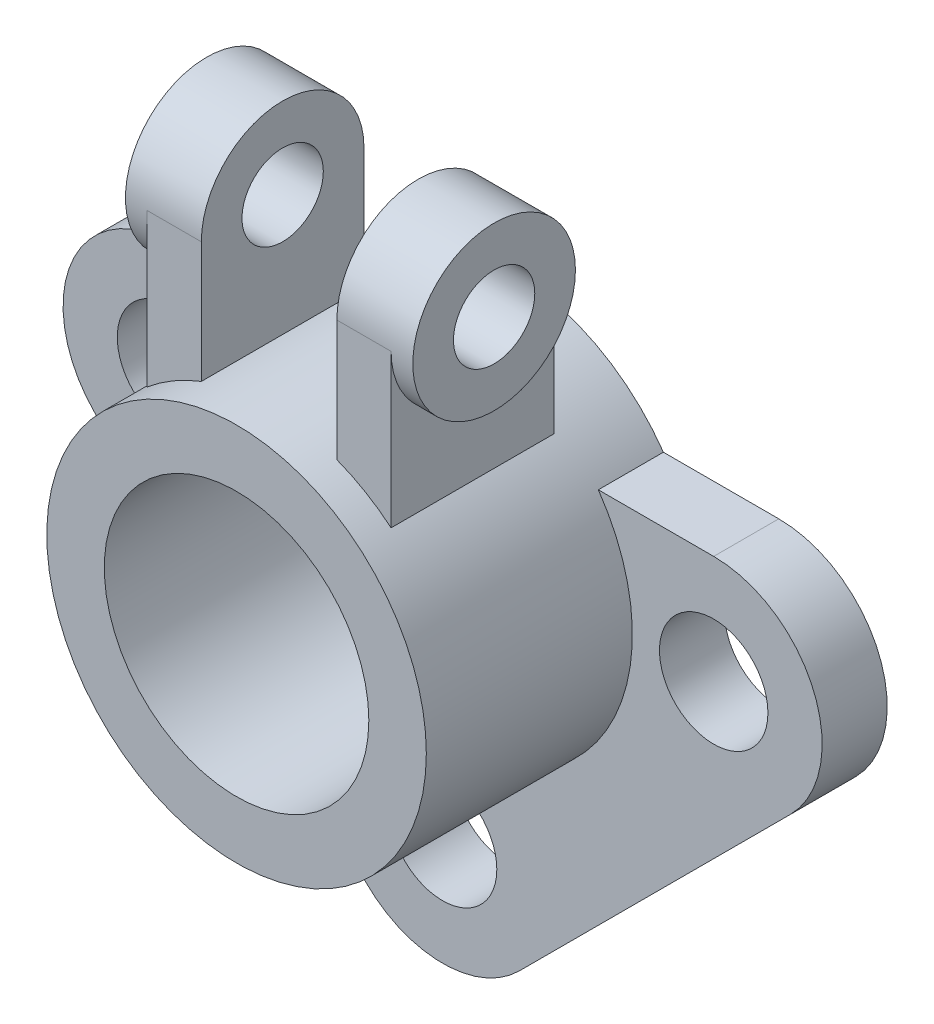
ISO-10303-21;
HEADER;
FILE_DESCRIPTION(('STEP AP214'),'2;1');
FILE_NAME('part.step','',(''),(''),'','','');
FILE_SCHEMA(('AUTOMOTIVE_DESIGN { 1 0 10303 214 1 1 1 1 }'));
ENDSEC;
DATA;
#1=APPLICATION_CONTEXT('core data for automotive mechanical design processes');
#2=APPLICATION_PROTOCOL_DEFINITION('international standard','automotive_design',2000,#1);
#3=PRODUCT_CONTEXT('',#1,'mechanical');
#4=PRODUCT('Part','Part','',(#3));
#5=PRODUCT_RELATED_PRODUCT_CATEGORY('part','',(#4));
#6=PRODUCT_DEFINITION_FORMATION('','',#4);
#7=PRODUCT_DEFINITION_CONTEXT('part definition',#1,'design');
#8=PRODUCT_DEFINITION('design','',#6,#7);
#9=PRODUCT_DEFINITION_SHAPE('','',#8);
#10=(LENGTH_UNIT() NAMED_UNIT(*) SI_UNIT(.MILLI.,.METRE.));
#11=(NAMED_UNIT(*) PLANE_ANGLE_UNIT() SI_UNIT($,.RADIAN.));
#12=(NAMED_UNIT(*) SI_UNIT($,.STERADIAN.) SOLID_ANGLE_UNIT());
#13=UNCERTAINTY_MEASURE_WITH_UNIT(LENGTH_MEASURE(1.E-05),#10,'distance_accuracy_value','');
#14=(GEOMETRIC_REPRESENTATION_CONTEXT(3) GLOBAL_UNCERTAINTY_ASSIGNED_CONTEXT((#13)) GLOBAL_UNIT_ASSIGNED_CONTEXT((#10,
#11,#12)) REPRESENTATION_CONTEXT('',''));
#15=CARTESIAN_POINT('',(0.,0.,0.));
#16=DIRECTION('',(0.,0.,1.));
#17=DIRECTION('',(1.,0.,0.));
#18=AXIS2_PLACEMENT_3D('',#15,#16,#17);
#19=CARTESIAN_POINT('',(0.,0.,50.));
#20=DIRECTION('',(0.,0.,-1.));
#21=DIRECTION('',(-1.,0.,0.));
#22=AXIS2_PLACEMENT_3D('',#19,#20,#21);
#23=CYLINDRICAL_SURFACE('',#22,35.);
#24=CARTESIAN_POINT('',(0.,0.,50.));
#25=DIRECTION('',(0.,0.,1.));
#26=DIRECTION('',(1.,0.,0.));
#27=AXIS2_PLACEMENT_3D('',#24,#25,#26);
#28=CIRCLE('',#27,35.);
#29=CARTESIAN_POINT('',(35.,0.,50.));
#30=VERTEX_POINT('',#29);
#31=EDGE_CURVE('E260',#30,#30,#28,.T.);
#32=ORIENTED_EDGE('',*,*,#31,.F.);
#33=EDGE_LOOP('',(#32));
#34=FACE_BOUND('',#33,.T.);
#35=DIRECTION('',(0.,0.,-1.));
#36=VECTOR('',#35,1.);
#37=CARTESIAN_POINT('',(-28.7228132326902,20.,12.));
#38=LINE('',#37,#36);
#39=CARTESIAN_POINT('',(-28.7228132326902,20.,12.));
#40=VERTEX_POINT('',#39);
#41=CARTESIAN_POINT('',(-28.7228132326902,20.,0.));
#42=VERTEX_POINT('',#41);
#43=EDGE_CURVE('E368',#40,#42,#38,.T.);
#44=ORIENTED_EDGE('',*,*,#43,.F.);
#45=CARTESIAN_POINT('',(0.,0.,12.));
#46=DIRECTION('',(0.,0.,1.));
#47=DIRECTION('',(1.,0.,0.));
#48=AXIS2_PLACEMENT_3D('',#45,#46,#47);
#49=CIRCLE('',#48,35.);
#50=CARTESIAN_POINT('',(28.7228132326901,20.,12.));
#51=VERTEX_POINT('',#50);
#52=EDGE_CURVE('E271',#40,#51,#49,.T.);
#53=ORIENTED_EDGE('',*,*,#52,.T.);
#54=DIRECTION('',(0.,0.,-1.));
#55=VECTOR('',#54,1.);
#56=CARTESIAN_POINT('',(28.7228132326901,20.,12.));
#57=LINE('',#56,#55);
#58=CARTESIAN_POINT('',(28.7228132326901,20.,0.));
#59=VERTEX_POINT('',#58);
#60=EDGE_CURVE('E311',#51,#59,#57,.T.);
#61=ORIENTED_EDGE('',*,*,#60,.T.);
#62=CARTESIAN_POINT('',(0.,0.,0.));
#63=DIRECTION('',(0.,0.,1.));
#64=DIRECTION('',(1.,0.,0.));
#65=AXIS2_PLACEMENT_3D('',#62,#63,#64);
#66=CIRCLE('',#65,35.);
#67=EDGE_CURVE('E261',#59,#42,#66,.T.);
#68=ORIENTED_EDGE('',*,*,#67,.T.);
#69=EDGE_LOOP('',(#44,#53,#61,#68));
#70=FACE_BOUND('',#69,.T.);
#71=CARTESIAN_POINT('',(0.,0.,14.));
#72=DIRECTION('',(0.,0.,1.));
#73=DIRECTION('',(1.,0.,0.));
#74=AXIS2_PLACEMENT_3D('',#71,#72,#73);
#75=CIRCLE('',#74,35.);
#76=CARTESIAN_POINT('',(22.5,26.809513236909,14.));
#77=VERTEX_POINT('',#76);
#78=CARTESIAN_POINT('',(12.5,32.6917420765551,14.));
#79=VERTEX_POINT('',#78);
#80=EDGE_CURVE('E376',#77,#79,#75,.T.);
#81=ORIENTED_EDGE('',*,*,#80,.F.);
#82=DIRECTION('',(0.,0.,-1.));
#83=VECTOR('',#82,1.);
#84=CARTESIAN_POINT('',(22.5,26.809513236909,50.));
#85=LINE('',#84,#83);
#86=CARTESIAN_POINT('',(22.5,26.809513236909,44.));
#87=VERTEX_POINT('',#86);
#88=EDGE_CURVE('E12',#77,#87,#85,.F.);
#89=ORIENTED_EDGE('',*,*,#88,.T.);
#90=CARTESIAN_POINT('',(0.,0.,44.));
#91=DIRECTION('',(0.,0.,-1.));
#92=DIRECTION('',(-1.,0.,0.));
#93=AXIS2_PLACEMENT_3D('',#90,#91,#92);
#94=CIRCLE('',#93,35.);
#95=CARTESIAN_POINT('',(12.5,32.6917420765551,44.));
#96=VERTEX_POINT('',#95);
#97=EDGE_CURVE('E65',#96,#87,#94,.T.);
#98=ORIENTED_EDGE('',*,*,#97,.F.);
#99=DIRECTION('',(0.,0.,-1.));
#100=VECTOR('',#99,1.);
#101=CARTESIAN_POINT('',(12.5,32.6917420765551,50.));
#102=LINE('',#101,#100);
#103=EDGE_CURVE('E372',#79,#96,#102,.F.);
#104=ORIENTED_EDGE('',*,*,#103,.F.);
#105=EDGE_LOOP('',(#81,#89,#98,#104));
#106=FACE_BOUND('',#105,.T.);
#107=CARTESIAN_POINT('',(0.,0.,44.));
#108=DIRECTION('',(0.,0.,1.));
#109=DIRECTION('',(1.,0.,0.));
#110=AXIS2_PLACEMENT_3D('',#107,#108,#109);
#111=CIRCLE('',#110,35.);
#112=CARTESIAN_POINT('',(-12.5,32.6917420765551,44.));
#113=VERTEX_POINT('',#112);
#114=CARTESIAN_POINT('',(-22.5,26.809513236909,44.));
#115=VERTEX_POINT('',#114);
#116=EDGE_CURVE('E72',#113,#115,#111,.T.);
#117=ORIENTED_EDGE('',*,*,#116,.T.);
#118=DIRECTION('',(0.,0.,-1.));
#119=VECTOR('',#118,1.);
#120=CARTESIAN_POINT('',(-22.5,26.809513236909,50.));
#121=LINE('',#120,#119);
#122=CARTESIAN_POINT('',(-22.5,26.809513236909,14.));
#123=VERTEX_POINT('',#122);
#124=EDGE_CURVE('E210',#123,#115,#121,.F.);
#125=ORIENTED_EDGE('',*,*,#124,.F.);
#126=CARTESIAN_POINT('',(0.,0.,14.));
#127=DIRECTION('',(0.,0.,-1.));
#128=DIRECTION('',(-1.,0.,0.));
#129=AXIS2_PLACEMENT_3D('',#126,#127,#128);
#130=CIRCLE('',#129,35.);
#131=CARTESIAN_POINT('',(-12.5,32.6917420765551,14.));
#132=VERTEX_POINT('',#131);
#133=EDGE_CURVE('E205',#123,#132,#130,.T.);
#134=ORIENTED_EDGE('',*,*,#133,.T.);
#135=DIRECTION('',(0.,0.,-1.));
#136=VECTOR('',#135,1.);
#137=CARTESIAN_POINT('',(-12.5,32.6917420765551,50.));
#138=LINE('',#137,#136);
#139=EDGE_CURVE('E77',#132,#113,#138,.F.);
#140=ORIENTED_EDGE('',*,*,#139,.T.);
#141=EDGE_LOOP('',(#117,#125,#134,#140));
#142=FACE_BOUND('',#141,.T.);
#143=ADVANCED_FACE('F56',(#34,#70,#106,#142),#23,.T.);
#144=CARTESIAN_POINT('',(0.,20.,12.));
#145=DIRECTION('',(0.,1.,0.));
#146=DIRECTION('',(-1.,0.,0.));
#147=AXIS2_PLACEMENT_3D('',#144,#145,#146);
#148=PLANE('',#147);
#149=DIRECTION('',(1.,0.,0.));
#150=VECTOR('',#149,1.);
#151=CARTESIAN_POINT('',(0.,20.,0.));
#152=LINE('',#151,#150);
#153=CARTESIAN_POINT('',(-50.,20.,0.));
#154=VERTEX_POINT('',#153);
#155=EDGE_CURVE('E265',#154,#42,#152,.T.);
#156=ORIENTED_EDGE('',*,*,#155,.F.);
#157=DIRECTION('',(0.,0.,-1.));
#158=VECTOR('',#157,1.);
#159=CARTESIAN_POINT('',(-50.,20.,12.));
#160=LINE('',#159,#158);
#161=CARTESIAN_POINT('',(-50.,20.,12.));
#162=VERTEX_POINT('',#161);
#163=EDGE_CURVE('E365',#162,#154,#160,.T.);
#164=ORIENTED_EDGE('',*,*,#163,.F.);
#165=DIRECTION('',(1.,0.,0.));
#166=VECTOR('',#165,1.);
#167=CARTESIAN_POINT('',(0.,20.,12.));
#168=LINE('',#167,#166);
#169=EDGE_CURVE('E274',#162,#40,#168,.T.);
#170=ORIENTED_EDGE('',*,*,#169,.T.);
#171=ORIENTED_EDGE('',*,*,#43,.T.);
#172=EDGE_LOOP('',(#156,#164,#170,#171));
#173=FACE_BOUND('',#172,.T.);
#174=ADVANCED_FACE('F412',(#173),#148,.T.);
#175=CARTESIAN_POINT('',(-50.,0.,12.));
#176=DIRECTION('',(0.,0.,-1.));
#177=DIRECTION('',(-1.,0.,0.));
#178=AXIS2_PLACEMENT_3D('',#175,#176,#177);
#179=CYLINDRICAL_SURFACE('',#178,20.);
#180=CARTESIAN_POINT('',(-50.,0.,0.));
#181=DIRECTION('',(0.,0.,1.));
#182=DIRECTION('',(1.,0.,0.));
#183=AXIS2_PLACEMENT_3D('',#180,#181,#182);
#184=CIRCLE('',#183,20.);
#185=CARTESIAN_POINT('',(-64.142135623731,-14.142135623731,0.));
#186=VERTEX_POINT('',#185);
#187=EDGE_CURVE('E315',#154,#186,#184,.T.);
#188=ORIENTED_EDGE('',*,*,#187,.T.);
#189=DIRECTION('',(0.,0.,-1.));
#190=VECTOR('',#189,1.);
#191=CARTESIAN_POINT('',(-64.142135623731,-14.142135623731,12.));
#192=LINE('',#191,#190);
#193=CARTESIAN_POINT('',(-64.142135623731,-14.142135623731,12.));
#194=VERTEX_POINT('',#193);
#195=EDGE_CURVE('E362',#194,#186,#192,.T.);
#196=ORIENTED_EDGE('',*,*,#195,.F.);
#197=CARTESIAN_POINT('',(-50.,0.,12.));
#198=DIRECTION('',(0.,0.,1.));
#199=DIRECTION('',(1.,0.,0.));
#200=AXIS2_PLACEMENT_3D('',#197,#198,#199);
#201=CIRCLE('',#200,20.);
#202=EDGE_CURVE('E279',#162,#194,#201,.T.);
#203=ORIENTED_EDGE('',*,*,#202,.F.);
#204=ORIENTED_EDGE('',*,*,#163,.T.);
#205=EDGE_LOOP('',(#188,#196,#203,#204));
#206=FACE_BOUND('',#205,.T.);
#207=ADVANCED_FACE('F58',(#206),#179,.T.);
#208=CARTESIAN_POINT('',(-39.142135623731,-39.142135623731,12.));
#209=DIRECTION('',(-0.707106781186547,-0.707106781186547,0.));
#210=DIRECTION('',(0.707106781186548,-0.707106781186548,0.));
#211=AXIS2_PLACEMENT_3D('',#208,#209,#210);
#212=PLANE('',#211);
#213=DIRECTION('',(-0.707106781186548,0.707106781186548,0.));
#214=VECTOR('',#213,1.);
#215=CARTESIAN_POINT('',(-39.142135623731,-39.142135623731,0.));
#216=LINE('',#215,#214);
#217=CARTESIAN_POINT('',(-14.142135623731,-64.142135623731,0.));
#218=VERTEX_POINT('',#217);
#219=EDGE_CURVE('E320',#218,#186,#216,.T.);
#220=ORIENTED_EDGE('',*,*,#219,.F.);
#221=DIRECTION('',(0.,0.,-1.));
#222=VECTOR('',#221,1.);
#223=CARTESIAN_POINT('',(-14.142135623731,-64.142135623731,12.));
#224=LINE('',#223,#222);
#225=CARTESIAN_POINT('',(-14.142135623731,-64.142135623731,12.));
#226=VERTEX_POINT('',#225);
#227=EDGE_CURVE('E359',#226,#218,#224,.T.);
#228=ORIENTED_EDGE('',*,*,#227,.F.);
#229=DIRECTION('',(-0.707106781186548,0.707106781186548,0.));
#230=VECTOR('',#229,1.);
#231=CARTESIAN_POINT('',(-39.142135623731,-39.142135623731,12.));
#232=LINE('',#231,#230);
#233=EDGE_CURVE('E283',#226,#194,#232,.T.);
#234=ORIENTED_EDGE('',*,*,#233,.T.);
#235=ORIENTED_EDGE('',*,*,#195,.T.);
#236=EDGE_LOOP('',(#220,#228,#234,#235));
#237=FACE_BOUND('',#236,.T.);
#238=ADVANCED_FACE('F462',(#237),#212,.T.);
#239=CARTESIAN_POINT('',(0.,-50.,12.));
#240=DIRECTION('',(0.,0.,-1.));
#241=DIRECTION('',(-1.,0.,0.));
#242=AXIS2_PLACEMENT_3D('',#239,#240,#241);
#243=CYLINDRICAL_SURFACE('',#242,20.);
#244=CARTESIAN_POINT('',(0.,-50.,0.));
#245=DIRECTION('',(0.,0.,1.));
#246=DIRECTION('',(1.,0.,0.));
#247=AXIS2_PLACEMENT_3D('',#244,#245,#246);
#248=CIRCLE('',#247,20.);
#249=CARTESIAN_POINT('',(14.1421356237309,-64.142135623731,0.));
#250=VERTEX_POINT('',#249);
#251=EDGE_CURVE('E324',#250,#218,#248,.F.);
#252=ORIENTED_EDGE('',*,*,#251,.F.);
#253=DIRECTION('',(0.,0.,-1.));
#254=VECTOR('',#253,1.);
#255=CARTESIAN_POINT('',(14.1421356237309,-64.142135623731,12.));
#256=LINE('',#255,#254);
#257=CARTESIAN_POINT('',(14.1421356237309,-64.142135623731,12.));
#258=VERTEX_POINT('',#257);
#259=EDGE_CURVE('E356',#258,#250,#256,.T.);
#260=ORIENTED_EDGE('',*,*,#259,.F.);
#261=CARTESIAN_POINT('',(0.,-50.,12.));
#262=DIRECTION('',(0.,0.,1.));
#263=DIRECTION('',(1.,0.,0.));
#264=AXIS2_PLACEMENT_3D('',#261,#262,#263);
#265=CIRCLE('',#264,20.);
#266=EDGE_CURVE('E287',#258,#226,#265,.F.);
#267=ORIENTED_EDGE('',*,*,#266,.T.);
#268=ORIENTED_EDGE('',*,*,#227,.T.);
#269=EDGE_LOOP('',(#252,#260,#267,#268));
#270=FACE_BOUND('',#269,.T.);
#271=ADVANCED_FACE('F459',(#270),#243,.T.);
#272=CARTESIAN_POINT('',(39.1421356237309,-39.1421356237309,12.));
#273=DIRECTION('',(0.707106781186547,-0.707106781186547,0.));
#274=DIRECTION('',(0.707106781186548,0.707106781186548,0.));
#275=AXIS2_PLACEMENT_3D('',#272,#273,#274);
#276=PLANE('',#275);
#277=DIRECTION('',(-0.707106781186548,-0.707106781186548,0.));
#278=VECTOR('',#277,1.);
#279=CARTESIAN_POINT('',(39.1421356237309,-39.1421356237309,0.));
#280=LINE('',#279,#278);
#281=CARTESIAN_POINT('',(64.142135623731,-14.1421356237309,0.));
#282=VERTEX_POINT('',#281);
#283=EDGE_CURVE('E328',#282,#250,#280,.T.);
#284=ORIENTED_EDGE('',*,*,#283,.F.);
#285=DIRECTION('',(0.,0.,-1.));
#286=VECTOR('',#285,1.);
#287=CARTESIAN_POINT('',(64.142135623731,-14.1421356237309,12.));
#288=LINE('',#287,#286);
#289=CARTESIAN_POINT('',(64.142135623731,-14.1421356237309,12.));
#290=VERTEX_POINT('',#289);
#291=EDGE_CURVE('E353',#290,#282,#288,.T.);
#292=ORIENTED_EDGE('',*,*,#291,.F.);
#293=DIRECTION('',(-0.707106781186548,-0.707106781186548,0.));
#294=VECTOR('',#293,1.);
#295=CARTESIAN_POINT('',(39.1421356237309,-39.1421356237309,12.));
#296=LINE('',#295,#294);
#297=EDGE_CURVE('E291',#290,#258,#296,.T.);
#298=ORIENTED_EDGE('',*,*,#297,.T.);
#299=ORIENTED_EDGE('',*,*,#259,.T.);
#300=EDGE_LOOP('',(#284,#292,#298,#299));
#301=FACE_BOUND('',#300,.T.);
#302=ADVANCED_FACE('F455',(#301),#276,.T.);
#303=CARTESIAN_POINT('',(50.,0.,12.));
#304=DIRECTION('',(0.,0.,-1.));
#305=DIRECTION('',(-1.,0.,0.));
#306=AXIS2_PLACEMENT_3D('',#303,#304,#305);
#307=CYLINDRICAL_SURFACE('',#306,20.);
#308=CARTESIAN_POINT('',(50.,0.,0.));
#309=DIRECTION('',(0.,0.,1.));
#310=DIRECTION('',(1.,0.,0.));
#311=AXIS2_PLACEMENT_3D('',#308,#309,#310);
#312=CIRCLE('',#311,20.);
#313=CARTESIAN_POINT('',(50.,20.,0.));
#314=VERTEX_POINT('',#313);
#315=EDGE_CURVE('E332',#314,#282,#312,.F.);
#316=ORIENTED_EDGE('',*,*,#315,.F.);
#317=DIRECTION('',(0.,0.,-1.));
#318=VECTOR('',#317,1.);
#319=CARTESIAN_POINT('',(50.,20.,12.));
#320=LINE('',#319,#318);
#321=CARTESIAN_POINT('',(50.,20.,12.));
#322=VERTEX_POINT('',#321);
#323=EDGE_CURVE('E350',#322,#314,#320,.T.);
#324=ORIENTED_EDGE('',*,*,#323,.F.);
#325=CARTESIAN_POINT('',(50.,0.,12.));
#326=DIRECTION('',(0.,0.,1.));
#327=DIRECTION('',(1.,0.,0.));
#328=AXIS2_PLACEMENT_3D('',#325,#326,#327);
#329=CIRCLE('',#328,20.);
#330=EDGE_CURVE('E295',#322,#290,#329,.F.);
#331=ORIENTED_EDGE('',*,*,#330,.T.);
#332=ORIENTED_EDGE('',*,*,#291,.T.);
#333=EDGE_LOOP('',(#316,#324,#331,#332));
#334=FACE_BOUND('',#333,.T.);
#335=ADVANCED_FACE('F446',(#334),#307,.T.);
#336=CARTESIAN_POINT('',(50.,0.,12.));
#337=DIRECTION('',(0.,0.,-1.));
#338=DIRECTION('',(-1.,0.,0.));
#339=AXIS2_PLACEMENT_3D('',#336,#337,#338);
#340=CYLINDRICAL_SURFACE('',#339,10.);
#341=CARTESIAN_POINT('',(50.,0.,12.));
#342=DIRECTION('',(0.,0.,1.));
#343=DIRECTION('',(1.,0.,0.));
#344=AXIS2_PLACEMENT_3D('',#341,#342,#343);
#345=CIRCLE('',#344,10.);
#346=CARTESIAN_POINT('',(60.,0.,12.));
#347=VERTEX_POINT('',#346);
#348=EDGE_CURVE('E303',#347,#347,#345,.T.);
#349=ORIENTED_EDGE('',*,*,#348,.T.);
#350=EDGE_LOOP('',(#349));
#351=FACE_BOUND('',#350,.T.);
#352=CARTESIAN_POINT('',(50.,0.,0.));
#353=DIRECTION('',(0.,0.,1.));
#354=DIRECTION('',(1.,0.,0.));
#355=AXIS2_PLACEMENT_3D('',#352,#353,#354);
#356=CIRCLE('',#355,10.);
#357=CARTESIAN_POINT('',(60.,0.,0.));
#358=VERTEX_POINT('',#357);
#359=EDGE_CURVE('E340',#358,#358,#356,.T.);
#360=ORIENTED_EDGE('',*,*,#359,.F.);
#361=EDGE_LOOP('',(#360));
#362=FACE_BOUND('',#361,.T.);
#363=ADVANCED_FACE('F442',(#351,#362),#340,.F.);
#364=CARTESIAN_POINT('',(0.,-50.,12.));
#365=DIRECTION('',(0.,0.,-1.));
#366=DIRECTION('',(-1.,0.,0.));
#367=AXIS2_PLACEMENT_3D('',#364,#365,#366);
#368=CYLINDRICAL_SURFACE('',#367,10.);
#369=CARTESIAN_POINT('',(0.,-50.,12.));
#370=DIRECTION('',(0.,0.,1.));
#371=DIRECTION('',(1.,0.,0.));
#372=AXIS2_PLACEMENT_3D('',#369,#370,#371);
#373=CIRCLE('',#372,10.);
#374=CARTESIAN_POINT('',(10.,-50.,12.));
#375=VERTEX_POINT('',#374);
#376=EDGE_CURVE('E299',#375,#375,#373,.T.);
#377=ORIENTED_EDGE('',*,*,#376,.T.);
#378=EDGE_LOOP('',(#377));
#379=FACE_BOUND('',#378,.T.);
#380=CARTESIAN_POINT('',(0.,-50.,0.));
#381=DIRECTION('',(0.,0.,1.));
#382=DIRECTION('',(1.,0.,0.));
#383=AXIS2_PLACEMENT_3D('',#380,#381,#382);
#384=CIRCLE('',#383,10.);
#385=CARTESIAN_POINT('',(10.,-50.,0.));
#386=VERTEX_POINT('',#385);
#387=EDGE_CURVE('E336',#386,#386,#384,.T.);
#388=ORIENTED_EDGE('',*,*,#387,.F.);
#389=EDGE_LOOP('',(#388));
#390=FACE_BOUND('',#389,.T.);
#391=ADVANCED_FACE('F445',(#379,#390),#368,.F.);
#392=EDGE_CURVE('E316',#59,#314,#152,.T.);
#393=ORIENTED_EDGE('',*,*,#392,.F.);
#394=ORIENTED_EDGE('',*,*,#60,.F.);
#395=EDGE_CURVE('E280',#51,#322,#168,.T.);
#396=ORIENTED_EDGE('',*,*,#395,.T.);
#397=ORIENTED_EDGE('',*,*,#323,.T.);
#398=EDGE_LOOP('',(#393,#394,#396,#397));
#399=FACE_BOUND('',#398,.T.);
#400=ADVANCED_FACE('F420',(#399),#148,.T.);
#401=CARTESIAN_POINT('',(-50.,0.,12.));
#402=DIRECTION('',(0.,0.,-1.));
#403=DIRECTION('',(-1.,0.,0.));
#404=AXIS2_PLACEMENT_3D('',#401,#402,#403);
#405=CYLINDRICAL_SURFACE('',#404,10.);
#406=CARTESIAN_POINT('',(-50.,0.,12.));
#407=DIRECTION('',(0.,0.,1.));
#408=DIRECTION('',(1.,0.,0.));
#409=AXIS2_PLACEMENT_3D('',#406,#407,#408);
#410=CIRCLE('',#409,10.);
#411=CARTESIAN_POINT('',(-40.,0.,12.));
#412=VERTEX_POINT('',#411);
#413=EDGE_CURVE('E307',#412,#412,#410,.T.);
#414=ORIENTED_EDGE('',*,*,#413,.T.);
#415=EDGE_LOOP('',(#414));
#416=FACE_BOUND('',#415,.T.);
#417=CARTESIAN_POINT('',(-50.,0.,0.));
#418=DIRECTION('',(0.,0.,1.));
#419=DIRECTION('',(1.,0.,0.));
#420=AXIS2_PLACEMENT_3D('',#417,#418,#419);
#421=CIRCLE('',#420,10.);
#422=CARTESIAN_POINT('',(-40.,0.,0.));
#423=VERTEX_POINT('',#422);
#424=EDGE_CURVE('E275',#423,#423,#421,.T.);
#425=ORIENTED_EDGE('',*,*,#424,.F.);
#426=EDGE_LOOP('',(#425));
#427=FACE_BOUND('',#426,.T.);
#428=ADVANCED_FACE('F434',(#416,#427),#405,.F.);
#429=CARTESIAN_POINT('',(0.,0.,12.));
#430=DIRECTION('',(0.,0.,1.));
#431=DIRECTION('',(1.,0.,0.));
#432=AXIS2_PLACEMENT_3D('',#429,#430,#431);
#433=PLANE('',#432);
#434=ORIENTED_EDGE('',*,*,#52,.F.);
#435=ORIENTED_EDGE('',*,*,#169,.F.);
#436=ORIENTED_EDGE('',*,*,#202,.T.);
#437=ORIENTED_EDGE('',*,*,#233,.F.);
#438=ORIENTED_EDGE('',*,*,#266,.F.);
#439=ORIENTED_EDGE('',*,*,#297,.F.);
#440=ORIENTED_EDGE('',*,*,#330,.F.);
#441=ORIENTED_EDGE('',*,*,#395,.F.);
#442=EDGE_LOOP('',(#434,#435,#436,#437,#438,#439,#440,#441));
#443=FACE_BOUND('',#442,.T.);
#444=ORIENTED_EDGE('',*,*,#376,.F.);
#445=EDGE_LOOP('',(#444));
#446=FACE_BOUND('',#445,.T.);
#447=ORIENTED_EDGE('',*,*,#348,.F.);
#448=EDGE_LOOP('',(#447));
#449=FACE_BOUND('',#448,.T.);
#450=ORIENTED_EDGE('',*,*,#413,.F.);
#451=EDGE_LOOP('',(#450));
#452=FACE_BOUND('',#451,.T.);
#453=ADVANCED_FACE('F431',(#443,#446,#449,#452),#433,.T.);
#454=CARTESIAN_POINT('',(0.,0.,0.));
#455=DIRECTION('',(0.,0.,1.));
#456=DIRECTION('',(1.,0.,0.));
#457=AXIS2_PLACEMENT_3D('',#454,#455,#456);
#458=PLANE('',#457);
#459=ORIENTED_EDGE('',*,*,#155,.T.);
#460=ORIENTED_EDGE('',*,*,#67,.F.);
#461=ORIENTED_EDGE('',*,*,#392,.T.);
#462=ORIENTED_EDGE('',*,*,#315,.T.);
#463=ORIENTED_EDGE('',*,*,#283,.T.);
#464=ORIENTED_EDGE('',*,*,#251,.T.);
#465=ORIENTED_EDGE('',*,*,#219,.T.);
#466=ORIENTED_EDGE('',*,*,#187,.F.);
#467=EDGE_LOOP('',(#459,#460,#461,#462,#463,#464,#465,#466));
#468=FACE_BOUND('',#467,.T.);
#469=ORIENTED_EDGE('',*,*,#387,.T.);
#470=EDGE_LOOP('',(#469));
#471=FACE_BOUND('',#470,.T.);
#472=ORIENTED_EDGE('',*,*,#359,.T.);
#473=EDGE_LOOP('',(#472));
#474=FACE_BOUND('',#473,.T.);
#475=ORIENTED_EDGE('',*,*,#424,.T.);
#476=EDGE_LOOP('',(#475));
#477=FACE_BOUND('',#476,.T.);
#478=CARTESIAN_POINT('',(0.,0.,0.));
#479=DIRECTION('',(0.,0.,1.));
#480=DIRECTION('',(1.,0.,0.));
#481=AXIS2_PLACEMENT_3D('',#478,#479,#480);
#482=CIRCLE('',#481,24.3967538902433);
#483=CARTESIAN_POINT('',(24.3967538902433,0.,0.));
#484=VERTEX_POINT('',#483);
#485=EDGE_CURVE('E255',#484,#484,#482,.T.);
#486=ORIENTED_EDGE('',*,*,#485,.T.);
#487=EDGE_LOOP('',(#486));
#488=FACE_BOUND('',#487,.T.);
#489=ADVANCED_FACE('F429',(#468,#471,#474,#477,#488),#458,.F.);
#490=CARTESIAN_POINT('',(0.,0.,50.));
#491=DIRECTION('',(0.,0.,-1.));
#492=DIRECTION('',(-1.,0.,0.));
#493=AXIS2_PLACEMENT_3D('',#490,#491,#492);
#494=CYLINDRICAL_SURFACE('',#493,24.3967538902433);
#495=CARTESIAN_POINT('',(0.,0.,50.));
#496=DIRECTION('',(0.,0.,1.));
#497=DIRECTION('',(1.,0.,0.));
#498=AXIS2_PLACEMENT_3D('',#495,#496,#497);
#499=CIRCLE('',#498,24.3967538902433);
#500=CARTESIAN_POINT('',(24.3967538902433,0.,50.));
#501=VERTEX_POINT('',#500);
#502=EDGE_CURVE('E256',#501,#501,#499,.T.);
#503=ORIENTED_EDGE('',*,*,#502,.T.);
#504=EDGE_LOOP('',(#503));
#505=FACE_BOUND('',#504,.T.);
#506=ORIENTED_EDGE('',*,*,#485,.F.);
#507=EDGE_LOOP('',(#506));
#508=FACE_BOUND('',#507,.T.);
#509=ADVANCED_FACE('F426',(#505,#508),#494,.F.);
#510=CARTESIAN_POINT('',(0.,0.,50.));
#511=DIRECTION('',(0.,0.,1.));
#512=DIRECTION('',(1.,0.,0.));
#513=AXIS2_PLACEMENT_3D('',#510,#511,#512);
#514=PLANE('',#513);
#515=ORIENTED_EDGE('',*,*,#502,.F.);
#516=EDGE_LOOP('',(#515));
#517=FACE_BOUND('',#516,.T.);
#518=ORIENTED_EDGE('',*,*,#31,.T.);
#519=EDGE_LOOP('',(#518));
#520=FACE_BOUND('',#519,.T.);
#521=ADVANCED_FACE('F425',(#517,#520),#514,.T.);
#522=CARTESIAN_POINT('',(22.5,0.,0.));
#523=DIRECTION('',(1.,0.,0.));
#524=DIRECTION('',(0.,0.,-1.));
#525=AXIS2_PLACEMENT_3D('',#522,#523,#524);
#526=PLANE('',#525);
#527=CARTESIAN_POINT('',(22.5,55.,29.));
#528=DIRECTION('',(1.,0.,0.));
#529=DIRECTION('',(0.,0.,-1.));
#530=AXIS2_PLACEMENT_3D('',#527,#528,#529);
#531=CIRCLE('',#530,15.);
#532=CARTESIAN_POINT('',(22.5,55.,44.));
#533=VERTEX_POINT('',#532);
#534=CARTESIAN_POINT('',(22.5,55.,14.));
#535=VERTEX_POINT('',#534);
#536=EDGE_CURVE('E230',#533,#535,#531,.T.);
#537=ORIENTED_EDGE('',*,*,#536,.F.);
#538=DIRECTION('',(0.,-1.,0.));
#539=VECTOR('',#538,1.);
#540=CARTESIAN_POINT('',(22.5,55.,44.));
#541=LINE('',#540,#539);
#542=EDGE_CURVE('E235',#533,#87,#541,.T.);
#543=ORIENTED_EDGE('',*,*,#542,.T.);
#544=ORIENTED_EDGE('',*,*,#88,.F.);
#545=DIRECTION('',(0.,1.,0.));
#546=VECTOR('',#545,1.);
#547=CARTESIAN_POINT('',(22.5,26.0429815624832,14.));
#548=LINE('',#547,#546);
#549=EDGE_CURVE('E239',#77,#535,#548,.T.);
#550=ORIENTED_EDGE('',*,*,#549,.T.);
#551=EDGE_LOOP('',(#537,#543,#544,#550));
#552=FACE_BOUND('',#551,.T.);
#553=ADVANCED_FACE('F389',(#552),#526,.T.);
#554=CARTESIAN_POINT('',(12.5,0.,0.));
#555=DIRECTION('',(1.,0.,0.));
#556=DIRECTION('',(0.,0.,-1.));
#557=AXIS2_PLACEMENT_3D('',#554,#555,#556);
#558=PLANE('',#557);
#559=CARTESIAN_POINT('',(12.5,55.,29.));
#560=DIRECTION('',(1.,0.,0.));
#561=DIRECTION('',(0.,0.,-1.));
#562=AXIS2_PLACEMENT_3D('',#559,#560,#561);
#563=CIRCLE('',#562,7.5);
#564=CARTESIAN_POINT('',(12.5,55.,21.5));
#565=VERTEX_POINT('',#564);
#566=EDGE_CURVE('E218',#565,#565,#563,.T.);
#567=ORIENTED_EDGE('',*,*,#566,.T.);
#568=EDGE_LOOP('',(#567));
#569=FACE_BOUND('',#568,.T.);
#570=DIRECTION('',(0.,-1.,0.));
#571=VECTOR('',#570,1.);
#572=CARTESIAN_POINT('',(12.5,35.,44.));
#573=LINE('',#572,#571);
#574=CARTESIAN_POINT('',(12.5,55.,44.));
#575=VERTEX_POINT('',#574);
#576=EDGE_CURVE('E234',#575,#96,#573,.T.);
#577=ORIENTED_EDGE('',*,*,#576,.F.);
#578=CARTESIAN_POINT('',(12.5,55.,29.));
#579=DIRECTION('',(1.,0.,0.));
#580=DIRECTION('',(0.,0.,-1.));
#581=AXIS2_PLACEMENT_3D('',#578,#579,#580);
#582=CIRCLE('',#581,15.);
#583=CARTESIAN_POINT('',(12.5,55.,14.));
#584=VERTEX_POINT('',#583);
#585=EDGE_CURVE('E226',#584,#575,#582,.T.);
#586=ORIENTED_EDGE('',*,*,#585,.F.);
#587=DIRECTION('',(0.,1.,0.));
#588=VECTOR('',#587,1.);
#589=CARTESIAN_POINT('',(12.5,26.0429815624832,14.));
#590=LINE('',#589,#588);
#591=EDGE_CURVE('E240',#79,#584,#590,.T.);
#592=ORIENTED_EDGE('',*,*,#591,.F.);
#593=ORIENTED_EDGE('',*,*,#103,.T.);
#594=EDGE_LOOP('',(#577,#586,#592,#593));
#595=FACE_BOUND('',#594,.T.);
#596=ADVANCED_FACE('F396',(#569,#595),#558,.F.);
#597=CARTESIAN_POINT('',(22.5,35.,44.));
#598=DIRECTION('',(0.,0.,-1.));
#599=DIRECTION('',(-1.,0.,0.));
#600=AXIS2_PLACEMENT_3D('',#597,#598,#599);
#601=PLANE('',#600);
#602=ORIENTED_EDGE('',*,*,#576,.T.);
#603=ORIENTED_EDGE('',*,*,#97,.T.);
#604=ORIENTED_EDGE('',*,*,#542,.F.);
#605=DIRECTION('',(-1.,0.,0.));
#606=VECTOR('',#605,1.);
#607=CARTESIAN_POINT('',(22.5,55.,44.));
#608=LINE('',#607,#606);
#609=EDGE_CURVE('E243',#533,#575,#608,.T.);
#610=ORIENTED_EDGE('',*,*,#609,.T.);
#611=EDGE_LOOP('',(#602,#603,#604,#610));
#612=FACE_BOUND('',#611,.T.);
#613=ADVANCED_FACE('F383',(#612),#601,.F.);
#614=CARTESIAN_POINT('',(22.5,26.0429815624832,14.));
#615=DIRECTION('',(0.,0.,1.));
#616=DIRECTION('',(1.,0.,0.));
#617=AXIS2_PLACEMENT_3D('',#614,#615,#616);
#618=PLANE('',#617);
#619=ORIENTED_EDGE('',*,*,#549,.F.);
#620=ORIENTED_EDGE('',*,*,#80,.T.);
#621=ORIENTED_EDGE('',*,*,#591,.T.);
#622=DIRECTION('',(-1.,0.,0.));
#623=VECTOR('',#622,1.);
#624=CARTESIAN_POINT('',(22.5,55.,14.));
#625=LINE('',#624,#623);
#626=EDGE_CURVE('E251',#535,#584,#625,.T.);
#627=ORIENTED_EDGE('',*,*,#626,.F.);
#628=EDGE_LOOP('',(#619,#620,#621,#627));
#629=FACE_BOUND('',#628,.T.);
#630=ADVANCED_FACE('F399',(#629),#618,.F.);
#631=CARTESIAN_POINT('',(12.5,55.,29.));
#632=DIRECTION('',(1.,0.,0.));
#633=DIRECTION('',(0.,0.,-1.));
#634=AXIS2_PLACEMENT_3D('',#631,#632,#633);
#635=CYLINDRICAL_SURFACE('',#634,15.);
#636=CARTESIAN_POINT('',(26.5,55.,29.));
#637=DIRECTION('',(1.,0.,0.));
#638=DIRECTION('',(0.,0.,-1.));
#639=AXIS2_PLACEMENT_3D('',#636,#637,#638);
#640=CIRCLE('',#639,15.);
#641=CARTESIAN_POINT('',(26.5,55.,14.));
#642=VERTEX_POINT('',#641);
#643=EDGE_CURVE('E222',#642,#642,#640,.T.);
#644=ORIENTED_EDGE('',*,*,#643,.F.);
#645=EDGE_LOOP('',(#644));
#646=FACE_BOUND('',#645,.T.);
#647=ORIENTED_EDGE('',*,*,#626,.T.);
#648=ORIENTED_EDGE('',*,*,#585,.T.);
#649=ORIENTED_EDGE('',*,*,#609,.F.);
#650=ORIENTED_EDGE('',*,*,#536,.T.);
#651=EDGE_LOOP('',(#647,#648,#649,#650));
#652=FACE_BOUND('',#651,.T.);
#653=ADVANCED_FACE('F393',(#646,#652),#635,.T.);
#654=CARTESIAN_POINT('',(26.5,55.,29.));
#655=DIRECTION('',(1.,0.,0.));
#656=DIRECTION('',(0.,0.,-1.));
#657=AXIS2_PLACEMENT_3D('',#654,#655,#656);
#658=PLANE('',#657);
#659=CARTESIAN_POINT('',(26.5,55.,29.));
#660=DIRECTION('',(1.,0.,0.));
#661=DIRECTION('',(0.,0.,-1.));
#662=AXIS2_PLACEMENT_3D('',#659,#660,#661);
#663=CIRCLE('',#662,7.5);
#664=CARTESIAN_POINT('',(26.5,55.,21.5));
#665=VERTEX_POINT('',#664);
#666=EDGE_CURVE('E214',#665,#665,#663,.T.);
#667=ORIENTED_EDGE('',*,*,#666,.F.);
#668=EDGE_LOOP('',(#667));
#669=FACE_BOUND('',#668,.T.);
#670=ORIENTED_EDGE('',*,*,#643,.T.);
#671=EDGE_LOOP('',(#670));
#672=FACE_BOUND('',#671,.T.);
#673=ADVANCED_FACE('F406',(#669,#672),#658,.T.);
#674=CARTESIAN_POINT('',(-70.,55.,29.));
#675=DIRECTION('',(1.,0.,0.));
#676=DIRECTION('',(0.,0.,-1.));
#677=AXIS2_PLACEMENT_3D('',#674,#675,#676);
#678=CYLINDRICAL_SURFACE('',#677,7.5);
#679=ORIENTED_EDGE('',*,*,#666,.T.);
#680=EDGE_LOOP('',(#679));
#681=FACE_BOUND('',#680,.T.);
#682=ORIENTED_EDGE('',*,*,#566,.F.);
#683=EDGE_LOOP('',(#682));
#684=FACE_BOUND('',#683,.T.);
#685=ADVANCED_FACE('F524',(#681,#684),#678,.F.);
#686=CARTESIAN_POINT('',(-22.5,0.,0.));
#687=DIRECTION('',(-1.,0.,0.));
#688=DIRECTION('',(0.,0.,-1.));
#689=AXIS2_PLACEMENT_3D('',#686,#687,#688);
#690=PLANE('',#689);
#691=CARTESIAN_POINT('',(-22.5,55.,29.));
#692=DIRECTION('',(1.,0.,0.));
#693=DIRECTION('',(0.,0.,-1.));
#694=AXIS2_PLACEMENT_3D('',#691,#692,#693);
#695=CIRCLE('',#694,15.);
#696=CARTESIAN_POINT('',(-22.5,55.,44.));
#697=VERTEX_POINT('',#696);
#698=CARTESIAN_POINT('',(-22.5,55.,14.));
#699=VERTEX_POINT('',#698);
#700=EDGE_CURVE('E174',#697,#699,#695,.T.);
#701=ORIENTED_EDGE('',*,*,#700,.T.);
#702=DIRECTION('',(0.,1.,0.));
#703=VECTOR('',#702,1.);
#704=CARTESIAN_POINT('',(-22.5,26.0429815624832,14.));
#705=LINE('',#704,#703);
#706=EDGE_CURVE('E180',#123,#699,#705,.T.);
#707=ORIENTED_EDGE('',*,*,#706,.F.);
#708=ORIENTED_EDGE('',*,*,#124,.T.);
#709=DIRECTION('',(0.,-1.,0.));
#710=VECTOR('',#709,1.);
#711=CARTESIAN_POINT('',(-22.5,55.,44.));
#712=LINE('',#711,#710);
#713=EDGE_CURVE('E195',#697,#115,#712,.T.);
#714=ORIENTED_EDGE('',*,*,#713,.F.);
#715=EDGE_LOOP('',(#701,#707,#708,#714));
#716=FACE_BOUND('',#715,.T.);
#717=ADVANCED_FACE('F516',(#716),#690,.T.);
#718=CARTESIAN_POINT('',(-12.5,0.,0.));
#719=DIRECTION('',(-1.,0.,0.));
#720=DIRECTION('',(0.,0.,-1.));
#721=AXIS2_PLACEMENT_3D('',#718,#719,#720);
#722=PLANE('',#721);
#723=CARTESIAN_POINT('',(-12.5,55.,29.));
#724=DIRECTION('',(1.,0.,0.));
#725=DIRECTION('',(0.,0.,-1.));
#726=AXIS2_PLACEMENT_3D('',#723,#724,#725);
#727=CIRCLE('',#726,7.5);
#728=CARTESIAN_POINT('',(-12.5,55.,21.5));
#729=VERTEX_POINT('',#728);
#730=EDGE_CURVE('E497',#729,#729,#727,.T.);
#731=ORIENTED_EDGE('',*,*,#730,.F.);
#732=EDGE_LOOP('',(#731));
#733=FACE_BOUND('',#732,.T.);
#734=DIRECTION('',(0.,-1.,0.));
#735=VECTOR('',#734,1.);
#736=CARTESIAN_POINT('',(-12.5,35.,44.));
#737=LINE('',#736,#735);
#738=CARTESIAN_POINT('',(-12.5,55.,44.));
#739=VERTEX_POINT('',#738);
#740=EDGE_CURVE('E184',#739,#113,#737,.T.);
#741=ORIENTED_EDGE('',*,*,#740,.T.);
#742=ORIENTED_EDGE('',*,*,#139,.F.);
#743=DIRECTION('',(0.,1.,0.));
#744=VECTOR('',#743,1.);
#745=CARTESIAN_POINT('',(-12.5,26.0429815624832,14.));
#746=LINE('',#745,#744);
#747=CARTESIAN_POINT('',(-12.5,55.,14.));
#748=VERTEX_POINT('',#747);
#749=EDGE_CURVE('E186',#132,#748,#746,.T.);
#750=ORIENTED_EDGE('',*,*,#749,.T.);
#751=CARTESIAN_POINT('',(-12.5,55.,29.));
#752=DIRECTION('',(1.,0.,0.));
#753=DIRECTION('',(0.,0.,-1.));
#754=AXIS2_PLACEMENT_3D('',#751,#752,#753);
#755=CIRCLE('',#754,15.);
#756=EDGE_CURVE('E171',#748,#739,#755,.T.);
#757=ORIENTED_EDGE('',*,*,#756,.T.);
#758=EDGE_LOOP('',(#741,#742,#750,#757));
#759=FACE_BOUND('',#758,.T.);
#760=ADVANCED_FACE('F183',(#733,#759),#722,.F.);
#761=CARTESIAN_POINT('',(-22.5,35.,44.));
#762=DIRECTION('',(0.,0.,-1.));
#763=DIRECTION('',(1.,0.,0.));
#764=AXIS2_PLACEMENT_3D('',#761,#762,#763);
#765=PLANE('',#764);
#766=ORIENTED_EDGE('',*,*,#740,.F.);
#767=DIRECTION('',(1.,0.,0.));
#768=VECTOR('',#767,1.);
#769=CARTESIAN_POINT('',(-22.5,55.,44.));
#770=LINE('',#769,#768);
#771=EDGE_CURVE('E168',#697,#739,#770,.T.);
#772=ORIENTED_EDGE('',*,*,#771,.F.);
#773=ORIENTED_EDGE('',*,*,#713,.T.);
#774=ORIENTED_EDGE('',*,*,#116,.F.);
#775=EDGE_LOOP('',(#766,#772,#773,#774));
#776=FACE_BOUND('',#775,.T.);
#777=ADVANCED_FACE('F190',(#776),#765,.F.);
#778=CARTESIAN_POINT('',(-22.5,26.0429815624832,14.));
#779=DIRECTION('',(0.,0.,1.));
#780=DIRECTION('',(-1.,0.,0.));
#781=AXIS2_PLACEMENT_3D('',#778,#779,#780);
#782=PLANE('',#781);
#783=ORIENTED_EDGE('',*,*,#706,.T.);
#784=DIRECTION('',(1.,0.,0.));
#785=VECTOR('',#784,1.);
#786=CARTESIAN_POINT('',(-22.5,55.,14.));
#787=LINE('',#786,#785);
#788=EDGE_CURVE('E179',#699,#748,#787,.T.);
#789=ORIENTED_EDGE('',*,*,#788,.T.);
#790=ORIENTED_EDGE('',*,*,#749,.F.);
#791=ORIENTED_EDGE('',*,*,#133,.F.);
#792=EDGE_LOOP('',(#783,#789,#790,#791));
#793=FACE_BOUND('',#792,.T.);
#794=ADVANCED_FACE('F522',(#793),#782,.F.);
#795=CARTESIAN_POINT('',(-12.5,55.,29.));
#796=DIRECTION('',(-1.,0.,0.));
#797=DIRECTION('',(0.,0.,-1.));
#798=AXIS2_PLACEMENT_3D('',#795,#796,#797);
#799=CYLINDRICAL_SURFACE('',#798,15.);
#800=CARTESIAN_POINT('',(-26.5,55.,29.));
#801=DIRECTION('',(1.,0.,0.));
#802=DIRECTION('',(0.,0.,-1.));
#803=AXIS2_PLACEMENT_3D('',#800,#801,#802);
#804=CIRCLE('',#803,15.);
#805=CARTESIAN_POINT('',(-26.5,55.,14.));
#806=VERTEX_POINT('',#805);
#807=EDGE_CURVE('E188',#806,#806,#804,.T.);
#808=ORIENTED_EDGE('',*,*,#807,.T.);
#809=EDGE_LOOP('',(#808));
#810=FACE_BOUND('',#809,.T.);
#811=ORIENTED_EDGE('',*,*,#788,.F.);
#812=ORIENTED_EDGE('',*,*,#700,.F.);
#813=ORIENTED_EDGE('',*,*,#771,.T.);
#814=ORIENTED_EDGE('',*,*,#756,.F.);
#815=EDGE_LOOP('',(#811,#812,#813,#814));
#816=FACE_BOUND('',#815,.T.);
#817=ADVANCED_FACE('F170',(#810,#816),#799,.T.);
#818=CARTESIAN_POINT('',(-26.5,55.,29.));
#819=DIRECTION('',(-1.,0.,0.));
#820=DIRECTION('',(0.,0.,-1.));
#821=AXIS2_PLACEMENT_3D('',#818,#819,#820);
#822=PLANE('',#821);
#823=CARTESIAN_POINT('',(-26.5,55.,29.));
#824=DIRECTION('',(1.,0.,0.));
#825=DIRECTION('',(0.,0.,-1.));
#826=AXIS2_PLACEMENT_3D('',#823,#824,#825);
#827=CIRCLE('',#826,7.5);
#828=CARTESIAN_POINT('',(-26.5,55.,21.5));
#829=VERTEX_POINT('',#828);
#830=EDGE_CURVE('E501',#829,#829,#827,.T.);
#831=ORIENTED_EDGE('',*,*,#830,.T.);
#832=EDGE_LOOP('',(#831));
#833=FACE_BOUND('',#832,.T.);
#834=ORIENTED_EDGE('',*,*,#807,.F.);
#835=EDGE_LOOP('',(#834));
#836=FACE_BOUND('',#835,.T.);
#837=ADVANCED_FACE('F506',(#833,#836),#822,.T.);
#838=CARTESIAN_POINT('',(70.,55.,29.));
#839=DIRECTION('',(-1.,0.,0.));
#840=DIRECTION('',(0.,0.,-1.));
#841=AXIS2_PLACEMENT_3D('',#838,#839,#840);
#842=CYLINDRICAL_SURFACE('',#841,7.5);
#843=ORIENTED_EDGE('',*,*,#830,.F.);
#844=EDGE_LOOP('',(#843));
#845=FACE_BOUND('',#844,.T.);
#846=ORIENTED_EDGE('',*,*,#730,.T.);
#847=EDGE_LOOP('',(#846));
#848=FACE_BOUND('',#847,.T.);
#849=ADVANCED_FACE('F509',(#845,#848),#842,.F.);
#850=CLOSED_SHELL('',(#143,#174,#207,#238,#271,#302,#335,#363,#391,#400,#428,#453,#489,#509,
#521,#553,#596,#613,#630,#653,#673,#685,#717,#760,#777,#794,#817,#837,#849));
#851=MANIFOLD_SOLID_BREP('B2',#850);
#852=ADVANCED_BREP_SHAPE_REPRESENTATION('',(#18,#851),#14);
#853=SHAPE_DEFINITION_REPRESENTATION(#9,#852);
ENDSEC;
END-ISO-10303-21;
